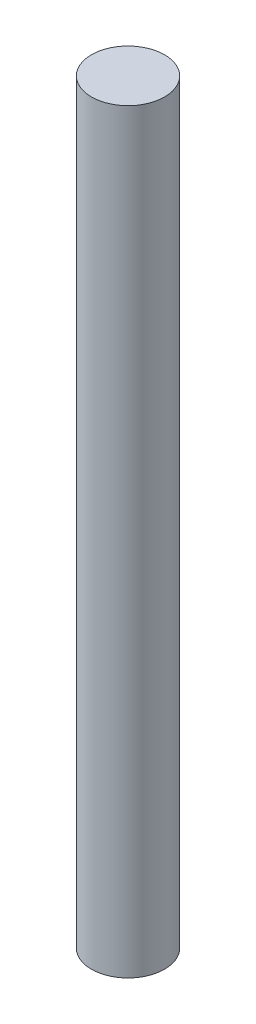
ISO-10303-21;
HEADER;
FILE_DESCRIPTION(('STEP AP214'),'2;1');
FILE_NAME('part.step','',(''),(''),'','','');
FILE_SCHEMA(('AUTOMOTIVE_DESIGN { 1 0 10303 214 1 1 1 1 }'));
ENDSEC;
DATA;
#1=APPLICATION_CONTEXT('core data for automotive mechanical design processes');
#2=APPLICATION_PROTOCOL_DEFINITION('international standard','automotive_design',2000,#1);
#3=PRODUCT_CONTEXT('',#1,'mechanical');
#4=PRODUCT('Part','Part','',(#3));
#5=PRODUCT_RELATED_PRODUCT_CATEGORY('part','',(#4));
#6=PRODUCT_DEFINITION_FORMATION('','',#4);
#7=PRODUCT_DEFINITION_CONTEXT('part definition',#1,'design');
#8=PRODUCT_DEFINITION('design','',#6,#7);
#9=PRODUCT_DEFINITION_SHAPE('','',#8);
#10=(LENGTH_UNIT() NAMED_UNIT(*) SI_UNIT(.MILLI.,.METRE.));
#11=(NAMED_UNIT(*) PLANE_ANGLE_UNIT() SI_UNIT($,.RADIAN.));
#12=(NAMED_UNIT(*) SI_UNIT($,.STERADIAN.) SOLID_ANGLE_UNIT());
#13=UNCERTAINTY_MEASURE_WITH_UNIT(LENGTH_MEASURE(1.E-05),#10,'distance_accuracy_value','');
#14=(GEOMETRIC_REPRESENTATION_CONTEXT(3) GLOBAL_UNCERTAINTY_ASSIGNED_CONTEXT((#13)) GLOBAL_UNIT_ASSIGNED_CONTEXT((#10,
#11,#12)) REPRESENTATION_CONTEXT('',''));
#15=CARTESIAN_POINT('',(0.,0.,0.));
#16=DIRECTION('',(0.,0.,1.));
#17=DIRECTION('',(1.,0.,0.));
#18=AXIS2_PLACEMENT_3D('',#15,#16,#17);
#19=CARTESIAN_POINT('',(-7.5,95.1973213818,0.));
#20=DIRECTION('',(0.,-1.,0.));
#21=DIRECTION('',(0.,0.,-1.));
#22=AXIS2_PLACEMENT_3D('',#19,#20,#21);
#23=PLANE('',#22);
#24=CARTESIAN_POINT('',(0.,95.1973213818,0.));
#25=DIRECTION('',(0.,-1.,0.));
#26=DIRECTION('',(1.,0.,0.));
#27=AXIS2_PLACEMENT_3D('',#24,#25,#26);
#28=CIRCLE('',#27,7.5);
#29=CARTESIAN_POINT('',(7.5,95.1973213818,0.));
#30=VERTEX_POINT('',#29);
#31=EDGE_CURVE('E54',#30,#30,#28,.T.);
#32=ORIENTED_EDGE('',*,*,#31,.F.);
#33=EDGE_LOOP('',(#32));
#34=FACE_BOUND('',#33,.T.);
#35=ADVANCED_FACE('F47',(#34),#23,.F.);
#36=CARTESIAN_POINT('',(-7.5,-59.8026786182,0.));
#37=DIRECTION('',(0.,-1.,0.));
#38=DIRECTION('',(0.,0.,-1.));
#39=AXIS2_PLACEMENT_3D('',#36,#37,#38);
#40=PLANE('',#39);
#41=CARTESIAN_POINT('',(0.,-59.8026786182,0.));
#42=DIRECTION('',(0.,-1.,0.));
#43=DIRECTION('',(1.,0.,0.));
#44=AXIS2_PLACEMENT_3D('',#41,#42,#43);
#45=CIRCLE('',#44,7.5);
#46=CARTESIAN_POINT('',(7.5,-59.8026786182,0.));
#47=VERTEX_POINT('',#46);
#48=EDGE_CURVE('E10',#47,#47,#45,.T.);
#49=ORIENTED_EDGE('',*,*,#48,.T.);
#50=EDGE_LOOP('',(#49));
#51=FACE_BOUND('',#50,.T.);
#52=ADVANCED_FACE('F70',(#51),#40,.T.);
#53=CARTESIAN_POINT('',(0.,17.6973213818,0.));
#54=DIRECTION('',(0.,-1.,0.));
#55=DIRECTION('',(1.,0.,0.));
#56=AXIS2_PLACEMENT_3D('',#53,#54,#55);
#57=CYLINDRICAL_SURFACE('',#56,7.5);
#58=ORIENTED_EDGE('',*,*,#31,.T.);
#59=EDGE_LOOP('',(#58));
#60=FACE_BOUND('',#59,.T.);
#61=ORIENTED_EDGE('',*,*,#48,.F.);
#62=EDGE_LOOP('',(#61));
#63=FACE_BOUND('',#62,.T.);
#64=ADVANCED_FACE('F66',(#60,#63),#57,.T.);
#65=CLOSED_SHELL('',(#35,#52,#64));
#66=MANIFOLD_SOLID_BREP('B2',#65);
#67=ADVANCED_BREP_SHAPE_REPRESENTATION('',(#18,#66),#14);
#68=SHAPE_DEFINITION_REPRESENTATION(#9,#67);
ENDSEC;
END-ISO-10303-21;
